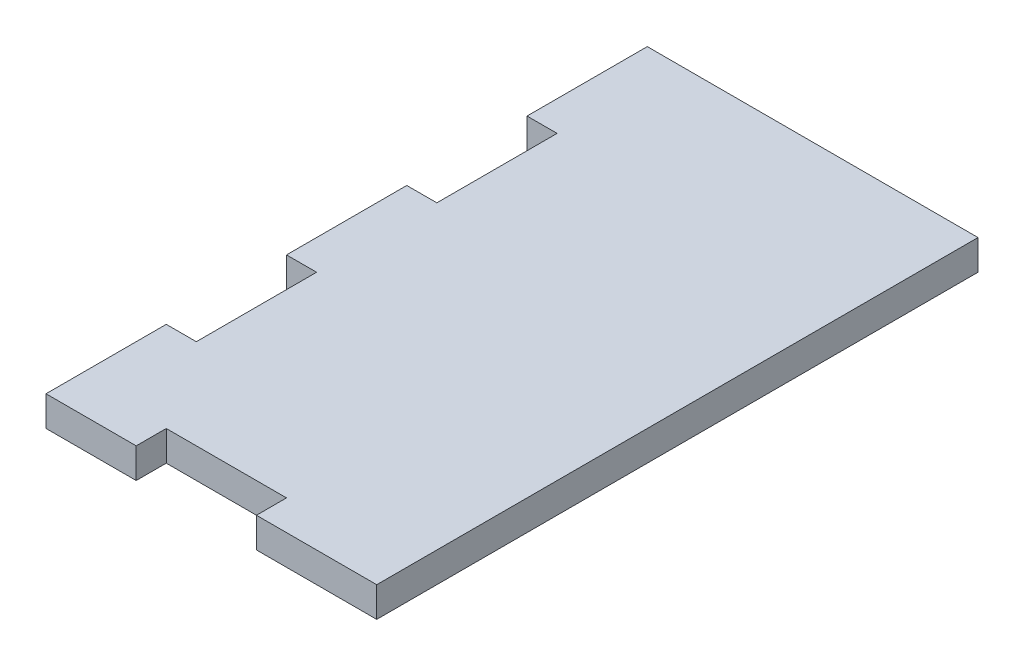
ISO-10303-21;
HEADER;
FILE_DESCRIPTION(('STEP AP214'),'2;1');
FILE_NAME('part.step','',(''),(''),'','','');
FILE_SCHEMA(('AUTOMOTIVE_DESIGN { 1 0 10303 214 1 1 1 1 }'));
ENDSEC;
DATA;
#1=APPLICATION_CONTEXT('core data for automotive mechanical design processes');
#2=APPLICATION_PROTOCOL_DEFINITION('international standard','automotive_design',2000,#1);
#3=PRODUCT_CONTEXT('',#1,'mechanical');
#4=PRODUCT('Part','Part','',(#3));
#5=PRODUCT_RELATED_PRODUCT_CATEGORY('part','',(#4));
#6=PRODUCT_DEFINITION_FORMATION('','',#4);
#7=PRODUCT_DEFINITION_CONTEXT('part definition',#1,'design');
#8=PRODUCT_DEFINITION('design','',#6,#7);
#9=PRODUCT_DEFINITION_SHAPE('','',#8);
#10=(LENGTH_UNIT() NAMED_UNIT(*) SI_UNIT(.MILLI.,.METRE.));
#11=(NAMED_UNIT(*) PLANE_ANGLE_UNIT() SI_UNIT($,.RADIAN.));
#12=(NAMED_UNIT(*) SI_UNIT($,.STERADIAN.) SOLID_ANGLE_UNIT());
#13=UNCERTAINTY_MEASURE_WITH_UNIT(LENGTH_MEASURE(1.E-05),#10,'distance_accuracy_value','');
#14=(GEOMETRIC_REPRESENTATION_CONTEXT(3) GLOBAL_UNCERTAINTY_ASSIGNED_CONTEXT((#13)) GLOBAL_UNIT_ASSIGNED_CONTEXT((#10,
#11,#12)) REPRESENTATION_CONTEXT('',''));
#15=CARTESIAN_POINT('',(0.,0.,0.));
#16=DIRECTION('',(0.,0.,1.));
#17=DIRECTION('',(1.,0.,0.));
#18=AXIS2_PLACEMENT_3D('',#15,#16,#17);
#19=CARTESIAN_POINT('',(19.05,3.175,0.));
#20=DIRECTION('',(-1.,0.,0.));
#21=DIRECTION('',(0.,0.,1.));
#22=AXIS2_PLACEMENT_3D('',#19,#20,#21);
#23=PLANE('',#22);
#24=DIRECTION('',(0.,0.,-1.));
#25=VECTOR('',#24,1.);
#26=CARTESIAN_POINT('',(19.05,0.,0.));
#27=LINE('',#26,#25);
#28=CARTESIAN_POINT('',(19.05,0.,0.));
#29=VERTEX_POINT('',#28);
#30=CARTESIAN_POINT('',(19.05,0.,-3.175));
#31=VERTEX_POINT('',#30);
#32=EDGE_CURVE('E324',#29,#31,#27,.T.);
#33=ORIENTED_EDGE('',*,*,#32,.F.);
#34=DIRECTION('',(0.,-1.,0.));
#35=VECTOR('',#34,1.);
#36=CARTESIAN_POINT('',(19.05,3.175,0.));
#37=LINE('',#36,#35);
#38=CARTESIAN_POINT('',(19.05,3.175,0.));
#39=VERTEX_POINT('',#38);
#40=EDGE_CURVE('E329',#39,#29,#37,.T.);
#41=ORIENTED_EDGE('',*,*,#40,.F.);
#42=DIRECTION('',(0.,0.,-1.));
#43=VECTOR('',#42,1.);
#44=CARTESIAN_POINT('',(19.05,3.175,0.));
#45=LINE('',#44,#43);
#46=CARTESIAN_POINT('',(19.05,3.175,-3.175));
#47=VERTEX_POINT('',#46);
#48=EDGE_CURVE('E334',#39,#47,#45,.T.);
#49=ORIENTED_EDGE('',*,*,#48,.T.);
#50=DIRECTION('',(0.,-1.,0.));
#51=VECTOR('',#50,1.);
#52=CARTESIAN_POINT('',(19.05,3.175,-3.175));
#53=LINE('',#52,#51);
#54=EDGE_CURVE('E333',#47,#31,#53,.T.);
#55=ORIENTED_EDGE('',*,*,#54,.T.);
#56=EDGE_LOOP('',(#33,#41,#49,#55));
#57=FACE_BOUND('',#56,.T.);
#58=ADVANCED_FACE('F149',(#57),#23,.T.);
#59=CARTESIAN_POINT('',(0.,3.175,-3.175));
#60=DIRECTION('',(0.,0.,-1.));
#61=DIRECTION('',(-1.,0.,0.));
#62=AXIS2_PLACEMENT_3D('',#59,#60,#61);
#63=PLANE('',#62);
#64=DIRECTION('',(1.,0.,0.));
#65=VECTOR('',#64,1.);
#66=CARTESIAN_POINT('',(0.,0.,-3.175));
#67=LINE('',#66,#65);
#68=CARTESIAN_POINT('',(6.35,0.,-3.175));
#69=VERTEX_POINT('',#68);
#70=EDGE_CURVE('E320',#69,#31,#67,.T.);
#71=ORIENTED_EDGE('',*,*,#70,.T.);
#72=ORIENTED_EDGE('',*,*,#54,.F.);
#73=DIRECTION('',(1.,0.,0.));
#74=VECTOR('',#73,1.);
#75=CARTESIAN_POINT('',(0.,3.175,-3.175));
#76=LINE('',#75,#74);
#77=CARTESIAN_POINT('',(6.35,3.175,-3.175));
#78=VERTEX_POINT('',#77);
#79=EDGE_CURVE('E425',#78,#47,#76,.T.);
#80=ORIENTED_EDGE('',*,*,#79,.F.);
#81=DIRECTION('',(0.,-1.,0.));
#82=VECTOR('',#81,1.);
#83=CARTESIAN_POINT('',(6.35,3.175,-3.175));
#84=LINE('',#83,#82);
#85=EDGE_CURVE('E338',#78,#69,#84,.T.);
#86=ORIENTED_EDGE('',*,*,#85,.T.);
#87=EDGE_LOOP('',(#71,#72,#80,#86));
#88=FACE_BOUND('',#87,.T.);
#89=ADVANCED_FACE('F477',(#88),#63,.F.);
#90=CARTESIAN_POINT('',(6.35,3.175,0.));
#91=DIRECTION('',(-1.,0.,0.));
#92=DIRECTION('',(0.,0.,1.));
#93=AXIS2_PLACEMENT_3D('',#90,#91,#92);
#94=PLANE('',#93);
#95=DIRECTION('',(0.,0.,-1.));
#96=VECTOR('',#95,1.);
#97=CARTESIAN_POINT('',(6.35,0.,0.));
#98=LINE('',#97,#96);
#99=CARTESIAN_POINT('',(6.35,0.,0.));
#100=VERTEX_POINT('',#99);
#101=EDGE_CURVE('E226',#100,#69,#98,.T.);
#102=ORIENTED_EDGE('',*,*,#101,.T.);
#103=ORIENTED_EDGE('',*,*,#85,.F.);
#104=DIRECTION('',(0.,0.,-1.));
#105=VECTOR('',#104,1.);
#106=CARTESIAN_POINT('',(6.35,3.175,0.));
#107=LINE('',#106,#105);
#108=CARTESIAN_POINT('',(6.35,3.175,0.));
#109=VERTEX_POINT('',#108);
#110=EDGE_CURVE('E429',#109,#78,#107,.T.);
#111=ORIENTED_EDGE('',*,*,#110,.F.);
#112=DIRECTION('',(0.,-1.,0.));
#113=VECTOR('',#112,1.);
#114=CARTESIAN_POINT('',(6.35,3.175,0.));
#115=LINE('',#114,#113);
#116=EDGE_CURVE('E342',#109,#100,#115,.T.);
#117=ORIENTED_EDGE('',*,*,#116,.T.);
#118=EDGE_LOOP('',(#102,#103,#111,#117));
#119=FACE_BOUND('',#118,.T.);
#120=ADVANCED_FACE('F481',(#119),#94,.F.);
#121=CARTESIAN_POINT('',(0.,3.175,0.));
#122=DIRECTION('',(0.,0.,-1.));
#123=DIRECTION('',(-1.,0.,0.));
#124=AXIS2_PLACEMENT_3D('',#121,#122,#123);
#125=PLANE('',#124);
#126=DIRECTION('',(1.,0.,0.));
#127=VECTOR('',#126,1.);
#128=CARTESIAN_POINT('',(0.,0.,0.));
#129=LINE('',#128,#127);
#130=CARTESIAN_POINT('',(-3.175,0.,0.));
#131=VERTEX_POINT('',#130);
#132=EDGE_CURVE('E217',#131,#100,#129,.T.);
#133=ORIENTED_EDGE('',*,*,#132,.T.);
#134=ORIENTED_EDGE('',*,*,#116,.F.);
#135=DIRECTION('',(1.,0.,0.));
#136=VECTOR('',#135,1.);
#137=CARTESIAN_POINT('',(0.,3.175,0.));
#138=LINE('',#137,#136);
#139=CARTESIAN_POINT('',(-3.175,3.175,0.));
#140=VERTEX_POINT('',#139);
#141=EDGE_CURVE('E238',#140,#109,#138,.T.);
#142=ORIENTED_EDGE('',*,*,#141,.F.);
#143=DIRECTION('',(0.,-1.,0.));
#144=VECTOR('',#143,1.);
#145=CARTESIAN_POINT('',(-3.175,3.175,0.));
#146=LINE('',#145,#144);
#147=EDGE_CURVE('E235',#140,#131,#146,.T.);
#148=ORIENTED_EDGE('',*,*,#147,.T.);
#149=EDGE_LOOP('',(#133,#134,#142,#148));
#150=FACE_BOUND('',#149,.T.);
#151=ADVANCED_FACE('F236',(#150),#125,.F.);
#152=CARTESIAN_POINT('',(0.,3.175,-63.5));
#153=DIRECTION('',(0.,0.,-1.));
#154=DIRECTION('',(-1.,0.,0.));
#155=AXIS2_PLACEMENT_3D('',#152,#153,#154);
#156=PLANE('',#155);
#157=DIRECTION('',(1.,0.,0.));
#158=VECTOR('',#157,1.);
#159=CARTESIAN_POINT('',(0.,0.,-63.5));
#160=LINE('',#159,#158);
#161=CARTESIAN_POINT('',(-3.175,0.,-63.5));
#162=VERTEX_POINT('',#161);
#163=CARTESIAN_POINT('',(31.75,0.,-63.5));
#164=VERTEX_POINT('',#163);
#165=EDGE_CURVE('E314',#162,#164,#160,.T.);
#166=ORIENTED_EDGE('',*,*,#165,.F.);
#167=DIRECTION('',(0.,-1.,0.));
#168=VECTOR('',#167,1.);
#169=CARTESIAN_POINT('',(-3.175,3.175,-63.5));
#170=LINE('',#169,#168);
#171=CARTESIAN_POINT('',(-3.175,3.175,-63.5));
#172=VERTEX_POINT('',#171);
#173=EDGE_CURVE('E368',#172,#162,#170,.T.);
#174=ORIENTED_EDGE('',*,*,#173,.F.);
#175=DIRECTION('',(1.,0.,0.));
#176=VECTOR('',#175,1.);
#177=CARTESIAN_POINT('',(0.,3.175,-63.5));
#178=LINE('',#177,#176);
#179=CARTESIAN_POINT('',(31.75,3.175,-63.5));
#180=VERTEX_POINT('',#179);
#181=EDGE_CURVE('E412',#172,#180,#178,.T.);
#182=ORIENTED_EDGE('',*,*,#181,.T.);
#183=DIRECTION('',(0.,-1.,0.));
#184=VECTOR('',#183,1.);
#185=CARTESIAN_POINT('',(31.75,3.175,-63.5));
#186=LINE('',#185,#184);
#187=EDGE_CURVE('E345',#180,#164,#186,.T.);
#188=ORIENTED_EDGE('',*,*,#187,.T.);
#189=EDGE_LOOP('',(#166,#174,#182,#188));
#190=FACE_BOUND('',#189,.T.);
#191=ADVANCED_FACE('F410',(#190),#156,.T.);
#192=CARTESIAN_POINT('',(31.75,3.175,0.));
#193=DIRECTION('',(-1.,0.,0.));
#194=DIRECTION('',(0.,0.,1.));
#195=AXIS2_PLACEMENT_3D('',#192,#193,#194);
#196=PLANE('',#195);
#197=DIRECTION('',(0.,0.,-1.));
#198=VECTOR('',#197,1.);
#199=CARTESIAN_POINT('',(31.75,0.,0.));
#200=LINE('',#199,#198);
#201=CARTESIAN_POINT('',(31.75,0.,0.));
#202=VERTEX_POINT('',#201);
#203=EDGE_CURVE('E416',#202,#164,#200,.T.);
#204=ORIENTED_EDGE('',*,*,#203,.T.);
#205=ORIENTED_EDGE('',*,*,#187,.F.);
#206=DIRECTION('',(0.,0.,-1.));
#207=VECTOR('',#206,1.);
#208=CARTESIAN_POINT('',(31.75,3.175,0.));
#209=LINE('',#208,#207);
#210=CARTESIAN_POINT('',(31.75,3.175,0.));
#211=VERTEX_POINT('',#210);
#212=EDGE_CURVE('E436',#211,#180,#209,.T.);
#213=ORIENTED_EDGE('',*,*,#212,.F.);
#214=DIRECTION('',(0.,-1.,0.));
#215=VECTOR('',#214,1.);
#216=CARTESIAN_POINT('',(31.75,3.175,0.));
#217=LINE('',#216,#215);
#218=EDGE_CURVE('E349',#211,#202,#217,.T.);
#219=ORIENTED_EDGE('',*,*,#218,.T.);
#220=EDGE_LOOP('',(#204,#205,#213,#219));
#221=FACE_BOUND('',#220,.T.);
#222=ADVANCED_FACE('F469',(#221),#196,.F.);
#223=EDGE_CURVE('E233',#29,#202,#129,.T.);
#224=ORIENTED_EDGE('',*,*,#223,.T.);
#225=ORIENTED_EDGE('',*,*,#218,.F.);
#226=EDGE_CURVE('E328',#39,#211,#138,.T.);
#227=ORIENTED_EDGE('',*,*,#226,.F.);
#228=ORIENTED_EDGE('',*,*,#40,.T.);
#229=EDGE_LOOP('',(#224,#225,#227,#228));
#230=FACE_BOUND('',#229,.T.);
#231=ADVANCED_FACE('F471',(#230),#125,.F.);
#232=CARTESIAN_POINT('',(0.,0.,0.));
#233=DIRECTION('',(0.,1.,0.));
#234=DIRECTION('',(0.,0.,1.));
#235=AXIS2_PLACEMENT_3D('',#232,#233,#234);
#236=PLANE('',#235);
#237=ORIENTED_EDGE('',*,*,#223,.F.);
#238=ORIENTED_EDGE('',*,*,#32,.T.);
#239=ORIENTED_EDGE('',*,*,#70,.F.);
#240=ORIENTED_EDGE('',*,*,#101,.F.);
#241=ORIENTED_EDGE('',*,*,#132,.F.);
#242=DIRECTION('',(0.,0.,-1.));
#243=VECTOR('',#242,1.);
#244=CARTESIAN_POINT('',(-3.175,0.,0.));
#245=LINE('',#244,#243);
#246=CARTESIAN_POINT('',(-3.175,0.,-12.7));
#247=VERTEX_POINT('',#246);
#248=EDGE_CURVE('E222',#131,#247,#245,.T.);
#249=ORIENTED_EDGE('',*,*,#248,.T.);
#250=DIRECTION('',(-1.,0.,0.));
#251=VECTOR('',#250,1.);
#252=CARTESIAN_POINT('',(0.,0.,-12.7));
#253=LINE('',#252,#251);
#254=CARTESIAN_POINT('',(0.,0.,-12.7));
#255=VERTEX_POINT('',#254);
#256=EDGE_CURVE('E246',#255,#247,#253,.T.);
#257=ORIENTED_EDGE('',*,*,#256,.F.);
#258=DIRECTION('',(0.,0.,-1.));
#259=VECTOR('',#258,1.);
#260=CARTESIAN_POINT('',(0.,0.,0.));
#261=LINE('',#260,#259);
#262=CARTESIAN_POINT('',(0.,0.,-25.4));
#263=VERTEX_POINT('',#262);
#264=EDGE_CURVE('E231',#255,#263,#261,.T.);
#265=ORIENTED_EDGE('',*,*,#264,.T.);
#266=DIRECTION('',(-1.,0.,0.));
#267=VECTOR('',#266,1.);
#268=CARTESIAN_POINT('',(0.,0.,-25.4));
#269=LINE('',#268,#267);
#270=CARTESIAN_POINT('',(-3.175,0.,-25.4));
#271=VERTEX_POINT('',#270);
#272=EDGE_CURVE('E254',#263,#271,#269,.T.);
#273=ORIENTED_EDGE('',*,*,#272,.T.);
#274=DIRECTION('',(0.,0.,-1.));
#275=VECTOR('',#274,1.);
#276=CARTESIAN_POINT('',(-3.175,0.,-25.4));
#277=LINE('',#276,#275);
#278=CARTESIAN_POINT('',(-3.175,0.,-38.1));
#279=VERTEX_POINT('',#278);
#280=EDGE_CURVE('E257',#271,#279,#277,.T.);
#281=ORIENTED_EDGE('',*,*,#280,.T.);
#282=DIRECTION('',(-1.,0.,0.));
#283=VECTOR('',#282,1.);
#284=CARTESIAN_POINT('',(0.,0.,-38.1));
#285=LINE('',#284,#283);
#286=CARTESIAN_POINT('',(0.,0.,-38.1));
#287=VERTEX_POINT('',#286);
#288=EDGE_CURVE('E263',#287,#279,#285,.T.);
#289=ORIENTED_EDGE('',*,*,#288,.F.);
#290=CARTESIAN_POINT('',(0.,0.,-50.8));
#291=VERTEX_POINT('',#290);
#292=EDGE_CURVE('E310',#287,#291,#261,.T.);
#293=ORIENTED_EDGE('',*,*,#292,.T.);
#294=DIRECTION('',(-1.,0.,0.));
#295=VECTOR('',#294,1.);
#296=CARTESIAN_POINT('',(0.,0.,-50.8));
#297=LINE('',#296,#295);
#298=CARTESIAN_POINT('',(-3.175,0.,-50.8));
#299=VERTEX_POINT('',#298);
#300=EDGE_CURVE('E283',#291,#299,#297,.T.);
#301=ORIENTED_EDGE('',*,*,#300,.T.);
#302=DIRECTION('',(0.,0.,-1.));
#303=VECTOR('',#302,1.);
#304=CARTESIAN_POINT('',(-3.175,0.,-50.8));
#305=LINE('',#304,#303);
#306=EDGE_CURVE('E357',#299,#162,#305,.T.);
#307=ORIENTED_EDGE('',*,*,#306,.T.);
#308=ORIENTED_EDGE('',*,*,#165,.T.);
#309=ORIENTED_EDGE('',*,*,#203,.F.);
#310=EDGE_LOOP('',(#237,#238,#239,#240,#241,#249,#257,#265,#273,#281,#289,#293,#301,#307,#308,#309));
#311=FACE_BOUND('',#310,.T.);
#312=ADVANCED_FACE('F220',(#311),#236,.F.);
#313=CARTESIAN_POINT('',(0.,3.175,0.));
#314=DIRECTION('',(0.,1.,0.));
#315=DIRECTION('',(0.,0.,1.));
#316=AXIS2_PLACEMENT_3D('',#313,#314,#315);
#317=PLANE('',#316);
#318=ORIENTED_EDGE('',*,*,#226,.T.);
#319=ORIENTED_EDGE('',*,*,#212,.T.);
#320=ORIENTED_EDGE('',*,*,#181,.F.);
#321=DIRECTION('',(0.,0.,-1.));
#322=VECTOR('',#321,1.);
#323=CARTESIAN_POINT('',(-3.175,3.175,-50.8));
#324=LINE('',#323,#322);
#325=CARTESIAN_POINT('',(-3.175,3.175,-50.8));
#326=VERTEX_POINT('',#325);
#327=EDGE_CURVE('E356',#326,#172,#324,.T.);
#328=ORIENTED_EDGE('',*,*,#327,.F.);
#329=DIRECTION('',(-1.,0.,0.));
#330=VECTOR('',#329,1.);
#331=CARTESIAN_POINT('',(0.,3.175,-50.8));
#332=LINE('',#331,#330);
#333=CARTESIAN_POINT('',(0.,3.175,-50.8));
#334=VERTEX_POINT('',#333);
#335=EDGE_CURVE('E353',#334,#326,#332,.T.);
#336=ORIENTED_EDGE('',*,*,#335,.F.);
#337=DIRECTION('',(0.,0.,-1.));
#338=VECTOR('',#337,1.);
#339=CARTESIAN_POINT('',(0.,3.175,0.));
#340=LINE('',#339,#338);
#341=CARTESIAN_POINT('',(0.,3.175,-38.1));
#342=VERTEX_POINT('',#341);
#343=EDGE_CURVE('E386',#342,#334,#340,.T.);
#344=ORIENTED_EDGE('',*,*,#343,.F.);
#345=DIRECTION('',(-1.,0.,0.));
#346=VECTOR('',#345,1.);
#347=CARTESIAN_POINT('',(0.,3.175,-38.1));
#348=LINE('',#347,#346);
#349=CARTESIAN_POINT('',(-3.175,3.175,-38.1));
#350=VERTEX_POINT('',#349);
#351=EDGE_CURVE('E266',#342,#350,#348,.T.);
#352=ORIENTED_EDGE('',*,*,#351,.T.);
#353=DIRECTION('',(0.,0.,-1.));
#354=VECTOR('',#353,1.);
#355=CARTESIAN_POINT('',(-3.175,3.175,-25.4));
#356=LINE('',#355,#354);
#357=CARTESIAN_POINT('',(-3.175,3.175,-25.4));
#358=VERTEX_POINT('',#357);
#359=EDGE_CURVE('E376',#358,#350,#356,.T.);
#360=ORIENTED_EDGE('',*,*,#359,.F.);
#361=DIRECTION('',(-1.,0.,0.));
#362=VECTOR('',#361,1.);
#363=CARTESIAN_POINT('',(0.,3.175,-25.4));
#364=LINE('',#363,#362);
#365=CARTESIAN_POINT('',(0.,3.175,-25.4));
#366=VERTEX_POINT('',#365);
#367=EDGE_CURVE('E272',#366,#358,#364,.T.);
#368=ORIENTED_EDGE('',*,*,#367,.F.);
#369=CARTESIAN_POINT('',(0.,3.175,-12.7));
#370=VERTEX_POINT('',#369);
#371=EDGE_CURVE('E297',#370,#366,#340,.T.);
#372=ORIENTED_EDGE('',*,*,#371,.F.);
#373=DIRECTION('',(-1.,0.,0.));
#374=VECTOR('',#373,1.);
#375=CARTESIAN_POINT('',(0.,3.175,-12.7));
#376=LINE('',#375,#374);
#377=CARTESIAN_POINT('',(-3.175,3.175,-12.7));
#378=VERTEX_POINT('',#377);
#379=EDGE_CURVE('E245',#370,#378,#376,.T.);
#380=ORIENTED_EDGE('',*,*,#379,.T.);
#381=DIRECTION('',(0.,0.,-1.));
#382=VECTOR('',#381,1.);
#383=CARTESIAN_POINT('',(-3.175,3.175,0.));
#384=LINE('',#383,#382);
#385=EDGE_CURVE('E241',#140,#378,#384,.T.);
#386=ORIENTED_EDGE('',*,*,#385,.F.);
#387=ORIENTED_EDGE('',*,*,#141,.T.);
#388=ORIENTED_EDGE('',*,*,#110,.T.);
#389=ORIENTED_EDGE('',*,*,#79,.T.);
#390=ORIENTED_EDGE('',*,*,#48,.F.);
#391=EDGE_LOOP('',(#318,#319,#320,#328,#336,#344,#352,#360,#368,#372,#380,#386,#387,#388,#389,#390));
#392=FACE_BOUND('',#391,.T.);
#393=ADVANCED_FACE('F289',(#392),#317,.T.);
#394=CARTESIAN_POINT('',(0.,3.175,0.));
#395=DIRECTION('',(-1.,0.,0.));
#396=DIRECTION('',(0.,0.,1.));
#397=AXIS2_PLACEMENT_3D('',#394,#395,#396);
#398=PLANE('',#397);
#399=ORIENTED_EDGE('',*,*,#371,.T.);
#400=DIRECTION('',(0.,-1.,0.));
#401=VECTOR('',#400,1.);
#402=CARTESIAN_POINT('',(0.,3.175,-25.4));
#403=LINE('',#402,#401);
#404=EDGE_CURVE('E273',#366,#263,#403,.T.);
#405=ORIENTED_EDGE('',*,*,#404,.T.);
#406=ORIENTED_EDGE('',*,*,#264,.F.);
#407=DIRECTION('',(0.,-1.,0.));
#408=VECTOR('',#407,1.);
#409=CARTESIAN_POINT('',(0.,3.175,-12.7));
#410=LINE('',#409,#408);
#411=EDGE_CURVE('E153',#370,#255,#410,.T.);
#412=ORIENTED_EDGE('',*,*,#411,.F.);
#413=EDGE_LOOP('',(#399,#405,#406,#412));
#414=FACE_BOUND('',#413,.T.);
#415=ADVANCED_FACE('F307',(#414),#398,.T.);
#416=ORIENTED_EDGE('',*,*,#343,.T.);
#417=DIRECTION('',(0.,-1.,0.));
#418=VECTOR('',#417,1.);
#419=CARTESIAN_POINT('',(0.,3.175,-50.8));
#420=LINE('',#419,#418);
#421=EDGE_CURVE('E12',#334,#291,#420,.T.);
#422=ORIENTED_EDGE('',*,*,#421,.T.);
#423=ORIENTED_EDGE('',*,*,#292,.F.);
#424=DIRECTION('',(0.,-1.,0.));
#425=VECTOR('',#424,1.);
#426=CARTESIAN_POINT('',(0.,3.175,-38.1));
#427=LINE('',#426,#425);
#428=EDGE_CURVE('E160',#342,#287,#427,.T.);
#429=ORIENTED_EDGE('',*,*,#428,.F.);
#430=EDGE_LOOP('',(#416,#422,#423,#429));
#431=FACE_BOUND('',#430,.T.);
#432=ADVANCED_FACE('F397',(#431),#398,.T.);
#433=CARTESIAN_POINT('',(-3.175,3.175,0.));
#434=DIRECTION('',(-1.,0.,0.));
#435=DIRECTION('',(0.,0.,1.));
#436=AXIS2_PLACEMENT_3D('',#433,#434,#435);
#437=PLANE('',#436);
#438=ORIENTED_EDGE('',*,*,#248,.F.);
#439=ORIENTED_EDGE('',*,*,#147,.F.);
#440=ORIENTED_EDGE('',*,*,#385,.T.);
#441=DIRECTION('',(0.,-1.,0.));
#442=VECTOR('',#441,1.);
#443=CARTESIAN_POINT('',(-3.175,3.175,-12.7));
#444=LINE('',#443,#442);
#445=EDGE_CURVE('E210',#378,#247,#444,.T.);
#446=ORIENTED_EDGE('',*,*,#445,.T.);
#447=EDGE_LOOP('',(#438,#439,#440,#446));
#448=FACE_BOUND('',#447,.T.);
#449=ADVANCED_FACE('F243',(#448),#437,.T.);
#450=CARTESIAN_POINT('',(0.,3.175,-12.7));
#451=DIRECTION('',(0.,0.,1.));
#452=DIRECTION('',(1.,0.,0.));
#453=AXIS2_PLACEMENT_3D('',#450,#451,#452);
#454=PLANE('',#453);
#455=ORIENTED_EDGE('',*,*,#256,.T.);
#456=ORIENTED_EDGE('',*,*,#445,.F.);
#457=ORIENTED_EDGE('',*,*,#379,.F.);
#458=ORIENTED_EDGE('',*,*,#411,.T.);
#459=EDGE_LOOP('',(#455,#456,#457,#458));
#460=FACE_BOUND('',#459,.T.);
#461=ADVANCED_FACE('F151',(#460),#454,.F.);
#462=CARTESIAN_POINT('',(-3.175,3.175,-25.4));
#463=DIRECTION('',(-1.,0.,0.));
#464=DIRECTION('',(0.,0.,1.));
#465=AXIS2_PLACEMENT_3D('',#462,#463,#464);
#466=PLANE('',#465);
#467=ORIENTED_EDGE('',*,*,#280,.F.);
#468=DIRECTION('',(0.,-1.,0.));
#469=VECTOR('',#468,1.);
#470=CARTESIAN_POINT('',(-3.175,3.175,-25.4));
#471=LINE('',#470,#469);
#472=EDGE_CURVE('E284',#358,#271,#471,.T.);
#473=ORIENTED_EDGE('',*,*,#472,.F.);
#474=ORIENTED_EDGE('',*,*,#359,.T.);
#475=DIRECTION('',(0.,-1.,0.));
#476=VECTOR('',#475,1.);
#477=CARTESIAN_POINT('',(-3.175,3.175,-38.1));
#478=LINE('',#477,#476);
#479=EDGE_CURVE('E280',#350,#279,#478,.T.);
#480=ORIENTED_EDGE('',*,*,#479,.T.);
#481=EDGE_LOOP('',(#467,#473,#474,#480));
#482=FACE_BOUND('',#481,.T.);
#483=ADVANCED_FACE('F391',(#482),#466,.T.);
#484=CARTESIAN_POINT('',(0.,3.175,-25.4));
#485=DIRECTION('',(0.,0.,1.));
#486=DIRECTION('',(1.,0.,0.));
#487=AXIS2_PLACEMENT_3D('',#484,#485,#486);
#488=PLANE('',#487);
#489=ORIENTED_EDGE('',*,*,#272,.F.);
#490=ORIENTED_EDGE('',*,*,#404,.F.);
#491=ORIENTED_EDGE('',*,*,#367,.T.);
#492=ORIENTED_EDGE('',*,*,#472,.T.);
#493=EDGE_LOOP('',(#489,#490,#491,#492));
#494=FACE_BOUND('',#493,.T.);
#495=ADVANCED_FACE('F495',(#494),#488,.T.);
#496=CARTESIAN_POINT('',(0.,3.175,-38.1));
#497=DIRECTION('',(0.,0.,1.));
#498=DIRECTION('',(1.,0.,0.));
#499=AXIS2_PLACEMENT_3D('',#496,#497,#498);
#500=PLANE('',#499);
#501=ORIENTED_EDGE('',*,*,#288,.T.);
#502=ORIENTED_EDGE('',*,*,#479,.F.);
#503=ORIENTED_EDGE('',*,*,#351,.F.);
#504=ORIENTED_EDGE('',*,*,#428,.T.);
#505=EDGE_LOOP('',(#501,#502,#503,#504));
#506=FACE_BOUND('',#505,.T.);
#507=ADVANCED_FACE('F388',(#506),#500,.F.);
#508=CARTESIAN_POINT('',(-3.175,3.175,-50.8));
#509=DIRECTION('',(-1.,0.,0.));
#510=DIRECTION('',(0.,0.,1.));
#511=AXIS2_PLACEMENT_3D('',#508,#509,#510);
#512=PLANE('',#511);
#513=ORIENTED_EDGE('',*,*,#306,.F.);
#514=DIRECTION('',(0.,-1.,0.));
#515=VECTOR('',#514,1.);
#516=CARTESIAN_POINT('',(-3.175,3.175,-50.8));
#517=LINE('',#516,#515);
#518=EDGE_CURVE('E361',#326,#299,#517,.T.);
#519=ORIENTED_EDGE('',*,*,#518,.F.);
#520=ORIENTED_EDGE('',*,*,#327,.T.);
#521=ORIENTED_EDGE('',*,*,#173,.T.);
#522=EDGE_LOOP('',(#513,#519,#520,#521));
#523=FACE_BOUND('',#522,.T.);
#524=ADVANCED_FACE('F405',(#523),#512,.T.);
#525=CARTESIAN_POINT('',(0.,3.175,-50.8));
#526=DIRECTION('',(0.,0.,1.));
#527=DIRECTION('',(1.,0.,0.));
#528=AXIS2_PLACEMENT_3D('',#525,#526,#527);
#529=PLANE('',#528);
#530=ORIENTED_EDGE('',*,*,#300,.F.);
#531=ORIENTED_EDGE('',*,*,#421,.F.);
#532=ORIENTED_EDGE('',*,*,#335,.T.);
#533=ORIENTED_EDGE('',*,*,#518,.T.);
#534=EDGE_LOOP('',(#530,#531,#532,#533));
#535=FACE_BOUND('',#534,.T.);
#536=ADVANCED_FACE('F399',(#535),#529,.T.);
#537=CLOSED_SHELL('',(#58,#89,#120,#151,#191,#222,#231,#312,#393,#415,#432,#449,#461,#483,#495,
#507,#524,#536));
#538=MANIFOLD_SOLID_BREP('B2',#537);
#539=ADVANCED_BREP_SHAPE_REPRESENTATION('',(#18,#538),#14);
#540=SHAPE_DEFINITION_REPRESENTATION(#9,#539);
ENDSEC;
END-ISO-10303-21;
